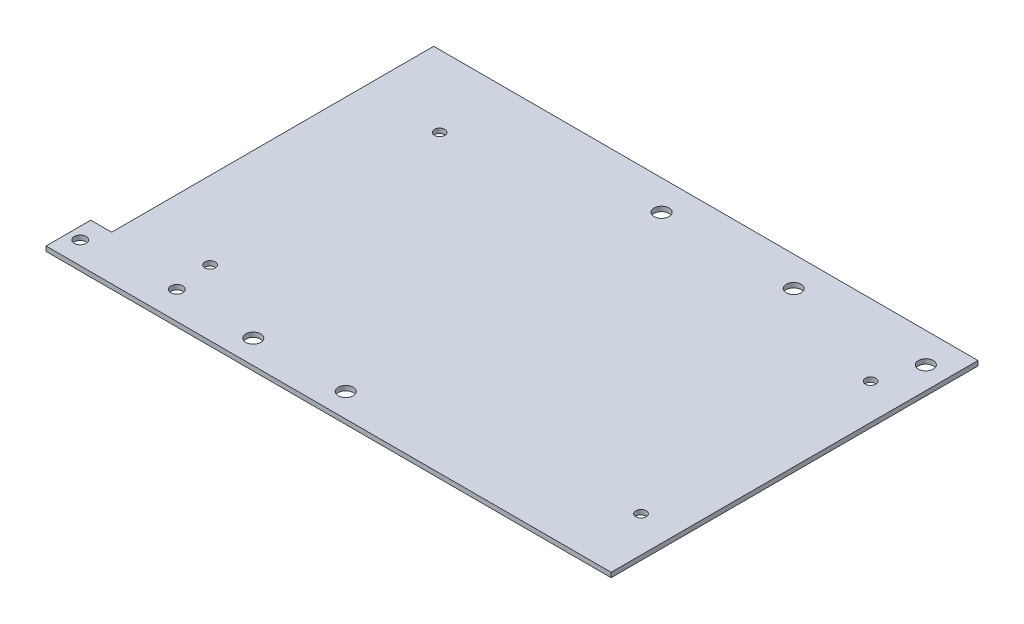
ISO-10303-21;
HEADER;
FILE_DESCRIPTION(('STEP AP214'),'2;1');
FILE_NAME('part.step','',(''),(''),'','','');
FILE_SCHEMA(('AUTOMOTIVE_DESIGN { 1 0 10303 214 1 1 1 1 }'));
ENDSEC;
DATA;
#1=APPLICATION_CONTEXT('core data for automotive mechanical design processes');
#2=APPLICATION_PROTOCOL_DEFINITION('international standard','automotive_design',2000,#1);
#3=PRODUCT_CONTEXT('',#1,'mechanical');
#4=PRODUCT('Part','Part','',(#3));
#5=PRODUCT_RELATED_PRODUCT_CATEGORY('part','',(#4));
#6=PRODUCT_DEFINITION_FORMATION('','',#4);
#7=PRODUCT_DEFINITION_CONTEXT('part definition',#1,'design');
#8=PRODUCT_DEFINITION('design','',#6,#7);
#9=PRODUCT_DEFINITION_SHAPE('','',#8);
#10=(LENGTH_UNIT() NAMED_UNIT(*) SI_UNIT(.MILLI.,.METRE.));
#11=(NAMED_UNIT(*) PLANE_ANGLE_UNIT() SI_UNIT($,.RADIAN.));
#12=(NAMED_UNIT(*) SI_UNIT($,.STERADIAN.) SOLID_ANGLE_UNIT());
#13=UNCERTAINTY_MEASURE_WITH_UNIT(LENGTH_MEASURE(1.E-05),#10,'distance_accuracy_value','');
#14=(GEOMETRIC_REPRESENTATION_CONTEXT(3) GLOBAL_UNCERTAINTY_ASSIGNED_CONTEXT((#13)) GLOBAL_UNIT_ASSIGNED_CONTEXT((#10,
#11,#12)) REPRESENTATION_CONTEXT('',''));
#15=CARTESIAN_POINT('',(0.,0.,0.));
#16=DIRECTION('',(0.,0.,1.));
#17=DIRECTION('',(1.,0.,0.));
#18=AXIS2_PLACEMENT_3D('',#15,#16,#17);
#19=CARTESIAN_POINT('',(366.71344660437,-3.17,2.50000000000005));
#20=DIRECTION('',(-1.,0.,0.));
#21=DIRECTION('',(0.,0.,-1.));
#22=AXIS2_PLACEMENT_3D('',#19,#20,#21);
#23=PLANE('',#22);
#24=DIRECTION('',(0.,-1.,0.));
#25=VECTOR('',#24,1.);
#26=CARTESIAN_POINT('',(366.71344660437,-3.17,2.50000000000005));
#27=LINE('',#26,#25);
#28=CARTESIAN_POINT('',(366.71344660437,0.,2.50000000000005));
#29=VERTEX_POINT('',#28);
#30=CARTESIAN_POINT('',(366.71344660437,-3.17,2.50000000000005));
#31=VERTEX_POINT('',#30);
#32=EDGE_CURVE('E11',#29,#31,#27,.T.);
#33=ORIENTED_EDGE('',*,*,#32,.F.);
#34=DIRECTION('',(0.,0.,-1.));
#35=VECTOR('',#34,1.);
#36=CARTESIAN_POINT('',(366.71344660437,0.,0.));
#37=LINE('',#36,#35);
#38=CARTESIAN_POINT('',(366.71344660437,0.,248.5));
#39=VERTEX_POINT('',#38);
#40=EDGE_CURVE('E104',#39,#29,#37,.T.);
#41=ORIENTED_EDGE('',*,*,#40,.F.);
#42=DIRECTION('',(0.,-1.,0.));
#43=VECTOR('',#42,1.);
#44=CARTESIAN_POINT('',(366.71344660437,-3.17,248.5));
#45=LINE('',#44,#43);
#46=CARTESIAN_POINT('',(366.71344660437,-3.17,248.5));
#47=VERTEX_POINT('',#46);
#48=EDGE_CURVE('E52',#39,#47,#45,.T.);
#49=ORIENTED_EDGE('',*,*,#48,.T.);
#50=DIRECTION('',(0.,0.,-1.));
#51=VECTOR('',#50,1.);
#52=CARTESIAN_POINT('',(366.71344660437,-3.17,2.50000000000005));
#53=LINE('',#52,#51);
#54=EDGE_CURVE('E135',#47,#31,#53,.T.);
#55=ORIENTED_EDGE('',*,*,#54,.T.);
#56=EDGE_LOOP('',(#33,#41,#49,#55));
#57=FACE_BOUND('',#56,.T.);
#58=ADVANCED_FACE('F43',(#57),#23,.F.);
#59=CARTESIAN_POINT('',(-12.28655339563,-3.17,248.5));
#60=DIRECTION('',(0.,0.,-1.));
#61=DIRECTION('',(1.,0.,0.));
#62=AXIS2_PLACEMENT_3D('',#59,#60,#61);
#63=PLANE('',#62);
#64=ORIENTED_EDGE('',*,*,#48,.F.);
#65=DIRECTION('',(1.,0.,0.));
#66=VECTOR('',#65,1.);
#67=CARTESIAN_POINT('',(0.,0.,248.5));
#68=LINE('',#67,#66);
#69=CARTESIAN_POINT('',(-12.28655339563,0.,248.5));
#70=VERTEX_POINT('',#69);
#71=EDGE_CURVE('E119',#70,#39,#68,.T.);
#72=ORIENTED_EDGE('',*,*,#71,.F.);
#73=DIRECTION('',(0.,-1.,0.));
#74=VECTOR('',#73,1.);
#75=CARTESIAN_POINT('',(-12.28655339563,-3.17,248.5));
#76=LINE('',#75,#74);
#77=CARTESIAN_POINT('',(-12.28655339563,-3.17,248.5));
#78=VERTEX_POINT('',#77);
#79=EDGE_CURVE('E129',#70,#78,#76,.T.);
#80=ORIENTED_EDGE('',*,*,#79,.T.);
#81=DIRECTION('',(1.,0.,0.));
#82=VECTOR('',#81,1.);
#83=CARTESIAN_POINT('',(-12.28655339563,-3.17,248.5));
#84=LINE('',#83,#82);
#85=EDGE_CURVE('E145',#78,#47,#84,.T.);
#86=ORIENTED_EDGE('',*,*,#85,.T.);
#87=EDGE_LOOP('',(#64,#72,#80,#86));
#88=FACE_BOUND('',#87,.T.);
#89=ADVANCED_FACE('F143',(#88),#63,.F.);
#90=CARTESIAN_POINT('',(-12.28655339563,-3.17,218.5));
#91=DIRECTION('',(1.,0.,0.));
#92=DIRECTION('',(0.,0.,1.));
#93=AXIS2_PLACEMENT_3D('',#90,#91,#92);
#94=PLANE('',#93);
#95=ORIENTED_EDGE('',*,*,#79,.F.);
#96=DIRECTION('',(0.,0.,-1.));
#97=VECTOR('',#96,1.);
#98=CARTESIAN_POINT('',(-12.28655339563,0.,0.));
#99=LINE('',#98,#97);
#100=CARTESIAN_POINT('',(-12.28655339563,0.,218.5));
#101=VERTEX_POINT('',#100);
#102=EDGE_CURVE('E120',#101,#70,#99,.F.);
#103=ORIENTED_EDGE('',*,*,#102,.F.);
#104=DIRECTION('',(0.,-1.,0.));
#105=VECTOR('',#104,1.);
#106=CARTESIAN_POINT('',(-12.28655339563,-3.17,218.5));
#107=LINE('',#106,#105);
#108=CARTESIAN_POINT('',(-12.28655339563,-3.17,218.5));
#109=VERTEX_POINT('',#108);
#110=EDGE_CURVE('E121',#101,#109,#107,.T.);
#111=ORIENTED_EDGE('',*,*,#110,.T.);
#112=DIRECTION('',(0.,0.,1.));
#113=VECTOR('',#112,1.);
#114=CARTESIAN_POINT('',(-12.28655339563,-3.17,218.5));
#115=LINE('',#114,#113);
#116=EDGE_CURVE('E149',#109,#78,#115,.T.);
#117=ORIENTED_EDGE('',*,*,#116,.T.);
#118=EDGE_LOOP('',(#95,#103,#111,#117));
#119=FACE_BOUND('',#118,.T.);
#120=ADVANCED_FACE('F210',(#119),#94,.F.);
#121=CARTESIAN_POINT('',(1.71344660436998,-3.17,218.5));
#122=DIRECTION('',(0.,0.,1.));
#123=DIRECTION('',(-1.,0.,0.));
#124=AXIS2_PLACEMENT_3D('',#121,#122,#123);
#125=PLANE('',#124);
#126=ORIENTED_EDGE('',*,*,#110,.F.);
#127=DIRECTION('',(1.,0.,0.));
#128=VECTOR('',#127,1.);
#129=CARTESIAN_POINT('',(0.,0.,218.5));
#130=LINE('',#129,#128);
#131=CARTESIAN_POINT('',(1.71344660436998,0.,218.5));
#132=VERTEX_POINT('',#131);
#133=EDGE_CURVE('E112',#132,#101,#130,.F.);
#134=ORIENTED_EDGE('',*,*,#133,.F.);
#135=DIRECTION('',(0.,-1.,0.));
#136=VECTOR('',#135,1.);
#137=CARTESIAN_POINT('',(1.71344660436998,-3.17,218.5));
#138=LINE('',#137,#136);
#139=CARTESIAN_POINT('',(1.71344660436998,-3.17,218.5));
#140=VERTEX_POINT('',#139);
#141=EDGE_CURVE('E64',#132,#140,#138,.T.);
#142=ORIENTED_EDGE('',*,*,#141,.T.);
#143=DIRECTION('',(-1.,0.,0.));
#144=VECTOR('',#143,1.);
#145=CARTESIAN_POINT('',(1.71344660436998,-3.17,218.5));
#146=LINE('',#145,#144);
#147=EDGE_CURVE('E97',#140,#109,#146,.T.);
#148=ORIENTED_EDGE('',*,*,#147,.T.);
#149=EDGE_LOOP('',(#126,#134,#142,#148));
#150=FACE_BOUND('',#149,.T.);
#151=ADVANCED_FACE('F211',(#150),#125,.F.);
#152=CARTESIAN_POINT('',(1.71344660436995,-3.17,2.50000000000004));
#153=DIRECTION('',(1.,0.,0.));
#154=DIRECTION('',(0.,0.,1.));
#155=AXIS2_PLACEMENT_3D('',#152,#153,#154);
#156=PLANE('',#155);
#157=ORIENTED_EDGE('',*,*,#141,.F.);
#158=DIRECTION('',(0.,0.,-1.));
#159=VECTOR('',#158,1.);
#160=CARTESIAN_POINT('',(1.71344660436995,0.,0.));
#161=LINE('',#160,#159);
#162=CARTESIAN_POINT('',(1.71344660436995,0.,2.50000000000004));
#163=VERTEX_POINT('',#162);
#164=EDGE_CURVE('E105',#163,#132,#161,.F.);
#165=ORIENTED_EDGE('',*,*,#164,.F.);
#166=DIRECTION('',(0.,-1.,0.));
#167=VECTOR('',#166,1.);
#168=CARTESIAN_POINT('',(1.71344660436995,-3.17,2.50000000000004));
#169=LINE('',#168,#167);
#170=CARTESIAN_POINT('',(1.71344660436995,-3.17,2.50000000000004));
#171=VERTEX_POINT('',#170);
#172=EDGE_CURVE('E50',#163,#171,#169,.T.);
#173=ORIENTED_EDGE('',*,*,#172,.T.);
#174=DIRECTION('',(0.,0.,1.));
#175=VECTOR('',#174,1.);
#176=CARTESIAN_POINT('',(1.71344660436995,-3.17,2.50000000000004));
#177=LINE('',#176,#175);
#178=EDGE_CURVE('E277',#171,#140,#177,.T.);
#179=ORIENTED_EDGE('',*,*,#178,.T.);
#180=EDGE_LOOP('',(#157,#165,#173,#179));
#181=FACE_BOUND('',#180,.T.);
#182=ADVANCED_FACE('F106',(#181),#156,.F.);
#183=CARTESIAN_POINT('',(174.553221886282,-3.17,22.5000000000001));
#184=DIRECTION('',(0.,-1.,0.));
#185=DIRECTION('',(0.,0.,-1.));
#186=AXIS2_PLACEMENT_3D('',#183,#184,#185);
#187=CYLINDRICAL_SURFACE('',#186,5.00000000000002);
#188=CARTESIAN_POINT('',(174.553221886282,-3.17,22.5000000000001));
#189=DIRECTION('',(0.,1.,0.));
#190=DIRECTION('',(0.,0.,1.));
#191=AXIS2_PLACEMENT_3D('',#188,#189,#190);
#192=CIRCLE('',#191,5.00000000000002);
#193=CARTESIAN_POINT('',(174.553221886282,-3.17,27.5000000000001));
#194=VERTEX_POINT('',#193);
#195=EDGE_CURVE('E116',#194,#194,#192,.T.);
#196=ORIENTED_EDGE('',*,*,#195,.F.);
#197=EDGE_LOOP('',(#196));
#198=FACE_BOUND('',#197,.T.);
#199=CARTESIAN_POINT('',(174.553221886282,0.,22.5000000000001));
#200=DIRECTION('',(0.,1.,0.));
#201=DIRECTION('',(0.,0.,1.));
#202=AXIS2_PLACEMENT_3D('',#199,#200,#201);
#203=CIRCLE('',#202,5.00000000000002);
#204=CARTESIAN_POINT('',(174.553221886282,0.,27.5000000000001));
#205=VERTEX_POINT('',#204);
#206=EDGE_CURVE('E154',#205,#205,#203,.T.);
#207=ORIENTED_EDGE('',*,*,#206,.T.);
#208=EDGE_LOOP('',(#207));
#209=FACE_BOUND('',#208,.T.);
#210=ADVANCED_FACE('F217',(#198,#209),#187,.F.);
#211=CARTESIAN_POINT('',(263.133334245326,-3.17,22.5));
#212=DIRECTION('',(0.,-1.,0.));
#213=DIRECTION('',(0.,0.,-1.));
#214=AXIS2_PLACEMENT_3D('',#211,#212,#213);
#215=CYLINDRICAL_SURFACE('',#214,4.99999999999999);
#216=CARTESIAN_POINT('',(263.133334245326,-3.17,22.5));
#217=DIRECTION('',(0.,1.,0.));
#218=DIRECTION('',(0.,0.,1.));
#219=AXIS2_PLACEMENT_3D('',#216,#217,#218);
#220=CIRCLE('',#219,4.99999999999999);
#221=CARTESIAN_POINT('',(263.133334245326,-3.17,27.5));
#222=VERTEX_POINT('',#221);
#223=EDGE_CURVE('E296',#222,#222,#220,.T.);
#224=ORIENTED_EDGE('',*,*,#223,.F.);
#225=EDGE_LOOP('',(#224));
#226=FACE_BOUND('',#225,.T.);
#227=CARTESIAN_POINT('',(263.133334245326,0.,22.5));
#228=DIRECTION('',(0.,1.,0.));
#229=DIRECTION('',(0.,0.,1.));
#230=AXIS2_PLACEMENT_3D('',#227,#228,#229);
#231=CIRCLE('',#230,4.99999999999999);
#232=CARTESIAN_POINT('',(263.133334245326,0.,27.5));
#233=VERTEX_POINT('',#232);
#234=EDGE_CURVE('E153',#233,#233,#231,.T.);
#235=ORIENTED_EDGE('',*,*,#234,.T.);
#236=EDGE_LOOP('',(#235));
#237=FACE_BOUND('',#236,.T.);
#238=ADVANCED_FACE('F218',(#226,#237),#215,.F.);
#239=CARTESIAN_POINT('',(342.71344660437,-3.17,50.4999999999996));
#240=DIRECTION('',(0.,-1.,0.));
#241=DIRECTION('',(0.,0.,-1.));
#242=AXIS2_PLACEMENT_3D('',#239,#240,#241);
#243=CYLINDRICAL_SURFACE('',#242,3.50000000000002);
#244=CARTESIAN_POINT('',(342.71344660437,-3.17,50.4999999999996));
#245=DIRECTION('',(0.,1.,0.));
#246=DIRECTION('',(0.,0.,1.));
#247=AXIS2_PLACEMENT_3D('',#244,#245,#246);
#248=CIRCLE('',#247,3.50000000000002);
#249=CARTESIAN_POINT('',(342.71344660437,-3.17,53.9999999999997));
#250=VERTEX_POINT('',#249);
#251=EDGE_CURVE('E305',#250,#250,#248,.T.);
#252=ORIENTED_EDGE('',*,*,#251,.F.);
#253=EDGE_LOOP('',(#252));
#254=FACE_BOUND('',#253,.T.);
#255=CARTESIAN_POINT('',(342.71344660437,0.,50.4999999999996));
#256=DIRECTION('',(0.,1.,0.));
#257=DIRECTION('',(0.,0.,1.));
#258=AXIS2_PLACEMENT_3D('',#255,#256,#257);
#259=CIRCLE('',#258,3.50000000000002);
#260=CARTESIAN_POINT('',(342.71344660437,0.,53.9999999999997));
#261=VERTEX_POINT('',#260);
#262=EDGE_CURVE('E160',#261,#261,#259,.T.);
#263=ORIENTED_EDGE('',*,*,#262,.T.);
#264=EDGE_LOOP('',(#263));
#265=FACE_BOUND('',#264,.T.);
#266=ADVANCED_FACE('F228',(#254,#265),#243,.F.);
#267=CARTESIAN_POINT('',(53.71344660437,-3.17,50.4999999999997));
#268=DIRECTION('',(0.,-1.,0.));
#269=DIRECTION('',(0.,0.,-1.));
#270=AXIS2_PLACEMENT_3D('',#267,#268,#269);
#271=CYLINDRICAL_SURFACE('',#270,3.5);
#272=CARTESIAN_POINT('',(53.71344660437,-3.17,50.4999999999997));
#273=DIRECTION('',(0.,1.,0.));
#274=DIRECTION('',(0.,0.,1.));
#275=AXIS2_PLACEMENT_3D('',#272,#273,#274);
#276=CIRCLE('',#275,3.5);
#277=CARTESIAN_POINT('',(53.71344660437,-3.17,53.9999999999997));
#278=VERTEX_POINT('',#277);
#279=EDGE_CURVE('E306',#278,#278,#276,.T.);
#280=ORIENTED_EDGE('',*,*,#279,.F.);
#281=EDGE_LOOP('',(#280));
#282=FACE_BOUND('',#281,.T.);
#283=CARTESIAN_POINT('',(53.71344660437,0.,50.4999999999997));
#284=DIRECTION('',(0.,1.,0.));
#285=DIRECTION('',(0.,0.,1.));
#286=AXIS2_PLACEMENT_3D('',#283,#284,#285);
#287=CIRCLE('',#286,3.5);
#288=CARTESIAN_POINT('',(53.71344660437,0.,53.9999999999997));
#289=VERTEX_POINT('',#288);
#290=EDGE_CURVE('E163',#289,#289,#287,.T.);
#291=ORIENTED_EDGE('',*,*,#290,.T.);
#292=EDGE_LOOP('',(#291));
#293=FACE_BOUND('',#292,.T.);
#294=ADVANCED_FACE('F232',(#282,#293),#271,.F.);
#295=CARTESIAN_POINT('',(342.71344660437,-3.17,204.5));
#296=DIRECTION('',(0.,-1.,0.));
#297=DIRECTION('',(0.,0.,-1.));
#298=AXIS2_PLACEMENT_3D('',#295,#296,#297);
#299=CYLINDRICAL_SURFACE('',#298,3.50000000000002);
#300=CARTESIAN_POINT('',(342.71344660437,-3.17,204.5));
#301=DIRECTION('',(0.,1.,0.));
#302=DIRECTION('',(0.,0.,1.));
#303=AXIS2_PLACEMENT_3D('',#300,#301,#302);
#304=CIRCLE('',#303,3.50000000000002);
#305=CARTESIAN_POINT('',(342.71344660437,-3.17,208.));
#306=VERTEX_POINT('',#305);
#307=EDGE_CURVE('E309',#306,#306,#304,.T.);
#308=ORIENTED_EDGE('',*,*,#307,.F.);
#309=EDGE_LOOP('',(#308));
#310=FACE_BOUND('',#309,.T.);
#311=CARTESIAN_POINT('',(342.71344660437,0.,204.5));
#312=DIRECTION('',(0.,1.,0.));
#313=DIRECTION('',(0.,0.,1.));
#314=AXIS2_PLACEMENT_3D('',#311,#312,#313);
#315=CIRCLE('',#314,3.50000000000002);
#316=CARTESIAN_POINT('',(342.71344660437,0.,208.));
#317=VERTEX_POINT('',#316);
#318=EDGE_CURVE('E165',#317,#317,#315,.T.);
#319=ORIENTED_EDGE('',*,*,#318,.T.);
#320=EDGE_LOOP('',(#319));
#321=FACE_BOUND('',#320,.T.);
#322=ADVANCED_FACE('F237',(#310,#321),#299,.F.);
#323=CARTESIAN_POINT('',(53.71344660437,-3.17,204.5));
#324=DIRECTION('',(0.,-1.,0.));
#325=DIRECTION('',(0.,0.,-1.));
#326=AXIS2_PLACEMENT_3D('',#323,#324,#325);
#327=CYLINDRICAL_SURFACE('',#326,3.5);
#328=CARTESIAN_POINT('',(53.71344660437,-3.17,204.5));
#329=DIRECTION('',(0.,1.,0.));
#330=DIRECTION('',(0.,0.,1.));
#331=AXIS2_PLACEMENT_3D('',#328,#329,#330);
#332=CIRCLE('',#331,3.5);
#333=CARTESIAN_POINT('',(53.71344660437,-3.17,208.));
#334=VERTEX_POINT('',#333);
#335=EDGE_CURVE('E313',#334,#334,#332,.T.);
#336=ORIENTED_EDGE('',*,*,#335,.F.);
#337=EDGE_LOOP('',(#336));
#338=FACE_BOUND('',#337,.T.);
#339=CARTESIAN_POINT('',(53.71344660437,0.,204.5));
#340=DIRECTION('',(0.,1.,0.));
#341=DIRECTION('',(0.,0.,1.));
#342=AXIS2_PLACEMENT_3D('',#339,#340,#341);
#343=CIRCLE('',#342,3.5);
#344=CARTESIAN_POINT('',(53.71344660437,0.,208.));
#345=VERTEX_POINT('',#344);
#346=EDGE_CURVE('E170',#345,#345,#343,.T.);
#347=ORIENTED_EDGE('',*,*,#346,.T.);
#348=EDGE_LOOP('',(#347));
#349=FACE_BOUND('',#348,.T.);
#350=ADVANCED_FACE('F243',(#338,#349),#327,.F.);
#351=CARTESIAN_POINT('',(110.71344660437,-3.17,232.5));
#352=DIRECTION('',(0.,-1.,0.));
#353=DIRECTION('',(0.,0.,-1.));
#354=AXIS2_PLACEMENT_3D('',#351,#352,#353);
#355=CYLINDRICAL_SURFACE('',#354,5.00000000000001);
#356=CARTESIAN_POINT('',(110.71344660437,-3.17,232.5));
#357=DIRECTION('',(0.,1.,0.));
#358=DIRECTION('',(0.,0.,1.));
#359=AXIS2_PLACEMENT_3D('',#356,#357,#358);
#360=CIRCLE('',#359,5.00000000000001);
#361=CARTESIAN_POINT('',(110.71344660437,-3.17,237.5));
#362=VERTEX_POINT('',#361);
#363=EDGE_CURVE('E274',#362,#362,#360,.T.);
#364=ORIENTED_EDGE('',*,*,#363,.F.);
#365=EDGE_LOOP('',(#364));
#366=FACE_BOUND('',#365,.T.);
#367=CARTESIAN_POINT('',(110.71344660437,0.,232.5));
#368=DIRECTION('',(0.,1.,0.));
#369=DIRECTION('',(0.,0.,1.));
#370=AXIS2_PLACEMENT_3D('',#367,#368,#369);
#371=CIRCLE('',#370,5.00000000000001);
#372=CARTESIAN_POINT('',(110.71344660437,0.,237.5));
#373=VERTEX_POINT('',#372);
#374=EDGE_CURVE('E167',#373,#373,#371,.T.);
#375=ORIENTED_EDGE('',*,*,#374,.T.);
#376=EDGE_LOOP('',(#375));
#377=FACE_BOUND('',#376,.T.);
#378=ADVANCED_FACE('F250',(#366,#377),#355,.F.);
#379=CARTESIAN_POINT('',(172.71344660437,-3.17,232.5));
#380=DIRECTION('',(0.,-1.,0.));
#381=DIRECTION('',(0.,0.,-1.));
#382=AXIS2_PLACEMENT_3D('',#379,#380,#381);
#383=CYLINDRICAL_SURFACE('',#382,5.00000000000002);
#384=CARTESIAN_POINT('',(172.71344660437,-3.17,232.5));
#385=DIRECTION('',(0.,1.,0.));
#386=DIRECTION('',(0.,0.,1.));
#387=AXIS2_PLACEMENT_3D('',#384,#385,#386);
#388=CIRCLE('',#387,5.00000000000002);
#389=CARTESIAN_POINT('',(172.71344660437,-3.17,237.5));
#390=VERTEX_POINT('',#389);
#391=EDGE_CURVE('E268',#390,#390,#388,.T.);
#392=ORIENTED_EDGE('',*,*,#391,.F.);
#393=EDGE_LOOP('',(#392));
#394=FACE_BOUND('',#393,.T.);
#395=CARTESIAN_POINT('',(172.71344660437,0.,232.5));
#396=DIRECTION('',(0.,1.,0.));
#397=DIRECTION('',(0.,0.,1.));
#398=AXIS2_PLACEMENT_3D('',#395,#396,#397);
#399=CIRCLE('',#398,5.00000000000002);
#400=CARTESIAN_POINT('',(172.71344660437,0.,237.5));
#401=VERTEX_POINT('',#400);
#402=EDGE_CURVE('E173',#401,#401,#399,.T.);
#403=ORIENTED_EDGE('',*,*,#402,.T.);
#404=EDGE_LOOP('',(#403));
#405=FACE_BOUND('',#404,.T.);
#406=ADVANCED_FACE('F252',(#394,#405),#383,.F.);
#407=CARTESIAN_POINT('',(351.71344660437,-3.17,22.5000000000001));
#408=DIRECTION('',(0.,-1.,0.));
#409=DIRECTION('',(0.,0.,-1.));
#410=AXIS2_PLACEMENT_3D('',#407,#408,#409);
#411=CYLINDRICAL_SURFACE('',#410,4.99999999999999);
#412=CARTESIAN_POINT('',(351.71344660437,-3.17,22.5000000000001));
#413=DIRECTION('',(0.,1.,0.));
#414=DIRECTION('',(0.,0.,1.));
#415=AXIS2_PLACEMENT_3D('',#412,#413,#414);
#416=CIRCLE('',#415,4.99999999999999);
#417=CARTESIAN_POINT('',(351.71344660437,-3.17,27.5000000000001));
#418=VERTEX_POINT('',#417);
#419=EDGE_CURVE('E265',#418,#418,#416,.T.);
#420=ORIENTED_EDGE('',*,*,#419,.F.);
#421=EDGE_LOOP('',(#420));
#422=FACE_BOUND('',#421,.T.);
#423=CARTESIAN_POINT('',(351.71344660437,0.,22.5000000000001));
#424=DIRECTION('',(0.,1.,0.));
#425=DIRECTION('',(0.,0.,1.));
#426=AXIS2_PLACEMENT_3D('',#423,#424,#425);
#427=CIRCLE('',#426,4.99999999999999);
#428=CARTESIAN_POINT('',(351.71344660437,0.,27.5000000000001));
#429=VERTEX_POINT('',#428);
#430=EDGE_CURVE('E176',#429,#429,#427,.T.);
#431=ORIENTED_EDGE('',*,*,#430,.T.);
#432=EDGE_LOOP('',(#431));
#433=FACE_BOUND('',#432,.T.);
#434=ADVANCED_FACE('F199',(#422,#433),#411,.F.);
#435=CARTESIAN_POINT('',(56.7540691016957,-3.17,229.789646052743));
#436=DIRECTION('',(0.,-1.,0.));
#437=DIRECTION('',(0.,0.,-1.));
#438=AXIS2_PLACEMENT_3D('',#435,#436,#437);
#439=CYLINDRICAL_SURFACE('',#438,4.00000000000001);
#440=CARTESIAN_POINT('',(56.7540691016957,-3.17,229.789646052743));
#441=DIRECTION('',(0.,1.,0.));
#442=DIRECTION('',(0.,0.,1.));
#443=AXIS2_PLACEMENT_3D('',#440,#441,#442);
#444=CIRCLE('',#443,4.00000000000001);
#445=CARTESIAN_POINT('',(56.7540691016957,-3.17,233.789646052743));
#446=VERTEX_POINT('',#445);
#447=EDGE_CURVE('E270',#446,#446,#444,.T.);
#448=ORIENTED_EDGE('',*,*,#447,.F.);
#449=EDGE_LOOP('',(#448));
#450=FACE_BOUND('',#449,.T.);
#451=CARTESIAN_POINT('',(56.7540691016957,0.,229.789646052743));
#452=DIRECTION('',(0.,1.,0.));
#453=DIRECTION('',(0.,0.,1.));
#454=AXIS2_PLACEMENT_3D('',#451,#452,#453);
#455=CIRCLE('',#454,4.00000000000001);
#456=CARTESIAN_POINT('',(56.7540691016957,0.,233.789646052743));
#457=VERTEX_POINT('',#456);
#458=EDGE_CURVE('E109',#457,#457,#455,.T.);
#459=ORIENTED_EDGE('',*,*,#458,.T.);
#460=EDGE_LOOP('',(#459));
#461=FACE_BOUND('',#460,.T.);
#462=ADVANCED_FACE('F181',(#450,#461),#439,.F.);
#463=CARTESIAN_POINT('',(-4.33335410133425,-3.17,233.5));
#464=DIRECTION('',(0.,-1.,0.));
#465=DIRECTION('',(0.,0.,-1.));
#466=AXIS2_PLACEMENT_3D('',#463,#464,#465);
#467=CYLINDRICAL_SURFACE('',#466,4.00000000000001);
#468=CARTESIAN_POINT('',(-4.33335410133425,-3.17,233.5));
#469=DIRECTION('',(0.,1.,0.));
#470=DIRECTION('',(0.,0.,1.));
#471=AXIS2_PLACEMENT_3D('',#468,#469,#470);
#472=CIRCLE('',#471,4.00000000000001);
#473=CARTESIAN_POINT('',(-4.33335410133425,-3.17,237.5));
#474=VERTEX_POINT('',#473);
#475=EDGE_CURVE('E272',#474,#474,#472,.T.);
#476=ORIENTED_EDGE('',*,*,#475,.F.);
#477=EDGE_LOOP('',(#476));
#478=FACE_BOUND('',#477,.T.);
#479=CARTESIAN_POINT('',(-4.33335410133425,0.,233.5));
#480=DIRECTION('',(0.,1.,0.));
#481=DIRECTION('',(0.,0.,1.));
#482=AXIS2_PLACEMENT_3D('',#479,#480,#481);
#483=CIRCLE('',#482,4.00000000000001);
#484=CARTESIAN_POINT('',(-4.33335410133425,0.,237.5));
#485=VERTEX_POINT('',#484);
#486=EDGE_CURVE('E110',#485,#485,#483,.T.);
#487=ORIENTED_EDGE('',*,*,#486,.T.);
#488=EDGE_LOOP('',(#487));
#489=FACE_BOUND('',#488,.T.);
#490=ADVANCED_FACE('F186',(#478,#489),#467,.F.);
#491=CARTESIAN_POINT('',(1.71344660436995,-3.17,2.50000000000004));
#492=DIRECTION('',(0.,0.,1.));
#493=DIRECTION('',(-1.,0.,0.));
#494=AXIS2_PLACEMENT_3D('',#491,#492,#493);
#495=PLANE('',#494);
#496=DIRECTION('',(1.,0.,0.));
#497=VECTOR('',#496,1.);
#498=CARTESIAN_POINT('',(0.,0.,2.50000000000005));
#499=LINE('',#498,#497);
#500=EDGE_CURVE('E92',#29,#163,#499,.F.);
#501=ORIENTED_EDGE('',*,*,#500,.F.);
#502=ORIENTED_EDGE('',*,*,#32,.T.);
#503=DIRECTION('',(-1.,0.,0.));
#504=VECTOR('',#503,1.);
#505=CARTESIAN_POINT('',(1.71344660436995,-3.17,2.50000000000004));
#506=LINE('',#505,#504);
#507=EDGE_CURVE('E95',#31,#171,#506,.T.);
#508=ORIENTED_EDGE('',*,*,#507,.T.);
#509=ORIENTED_EDGE('',*,*,#172,.F.);
#510=EDGE_LOOP('',(#501,#502,#508,#509));
#511=FACE_BOUND('',#510,.T.);
#512=ADVANCED_FACE('F44',(#511),#495,.F.);
#513=CARTESIAN_POINT('',(0.,-3.17,0.));
#514=DIRECTION('',(0.,-1.,0.));
#515=DIRECTION('',(0.,0.,-1.));
#516=AXIS2_PLACEMENT_3D('',#513,#514,#515);
#517=PLANE('',#516);
#518=ORIENTED_EDGE('',*,*,#195,.T.);
#519=EDGE_LOOP('',(#518));
#520=FACE_BOUND('',#519,.T.);
#521=ORIENTED_EDGE('',*,*,#223,.T.);
#522=EDGE_LOOP('',(#521));
#523=FACE_BOUND('',#522,.T.);
#524=ORIENTED_EDGE('',*,*,#251,.T.);
#525=EDGE_LOOP('',(#524));
#526=FACE_BOUND('',#525,.T.);
#527=ORIENTED_EDGE('',*,*,#279,.T.);
#528=EDGE_LOOP('',(#527));
#529=FACE_BOUND('',#528,.T.);
#530=ORIENTED_EDGE('',*,*,#307,.T.);
#531=EDGE_LOOP('',(#530));
#532=FACE_BOUND('',#531,.T.);
#533=ORIENTED_EDGE('',*,*,#335,.T.);
#534=EDGE_LOOP('',(#533));
#535=FACE_BOUND('',#534,.T.);
#536=ORIENTED_EDGE('',*,*,#363,.T.);
#537=EDGE_LOOP('',(#536));
#538=FACE_BOUND('',#537,.T.);
#539=ORIENTED_EDGE('',*,*,#391,.T.);
#540=EDGE_LOOP('',(#539));
#541=FACE_BOUND('',#540,.T.);
#542=ORIENTED_EDGE('',*,*,#419,.T.);
#543=EDGE_LOOP('',(#542));
#544=FACE_BOUND('',#543,.T.);
#545=ORIENTED_EDGE('',*,*,#447,.T.);
#546=EDGE_LOOP('',(#545));
#547=FACE_BOUND('',#546,.T.);
#548=ORIENTED_EDGE('',*,*,#475,.T.);
#549=EDGE_LOOP('',(#548));
#550=FACE_BOUND('',#549,.T.);
#551=ORIENTED_EDGE('',*,*,#178,.F.);
#552=ORIENTED_EDGE('',*,*,#507,.F.);
#553=ORIENTED_EDGE('',*,*,#54,.F.);
#554=ORIENTED_EDGE('',*,*,#85,.F.);
#555=ORIENTED_EDGE('',*,*,#116,.F.);
#556=ORIENTED_EDGE('',*,*,#147,.F.);
#557=EDGE_LOOP('',(#551,#552,#553,#554,#555,#556));
#558=FACE_BOUND('',#557,.T.);
#559=ADVANCED_FACE('F136',(#520,#523,#526,#529,#532,#535,#538,#541,#544,#547,#550,#558),#517,.T.);
#560=CARTESIAN_POINT('',(0.,0.,0.));
#561=DIRECTION('',(0.,-1.,0.));
#562=DIRECTION('',(0.,0.,-1.));
#563=AXIS2_PLACEMENT_3D('',#560,#561,#562);
#564=PLANE('',#563);
#565=ORIENTED_EDGE('',*,*,#206,.F.);
#566=EDGE_LOOP('',(#565));
#567=FACE_BOUND('',#566,.T.);
#568=ORIENTED_EDGE('',*,*,#234,.F.);
#569=EDGE_LOOP('',(#568));
#570=FACE_BOUND('',#569,.T.);
#571=ORIENTED_EDGE('',*,*,#262,.F.);
#572=EDGE_LOOP('',(#571));
#573=FACE_BOUND('',#572,.T.);
#574=ORIENTED_EDGE('',*,*,#290,.F.);
#575=EDGE_LOOP('',(#574));
#576=FACE_BOUND('',#575,.T.);
#577=ORIENTED_EDGE('',*,*,#318,.F.);
#578=EDGE_LOOP('',(#577));
#579=FACE_BOUND('',#578,.T.);
#580=ORIENTED_EDGE('',*,*,#346,.F.);
#581=EDGE_LOOP('',(#580));
#582=FACE_BOUND('',#581,.T.);
#583=ORIENTED_EDGE('',*,*,#374,.F.);
#584=EDGE_LOOP('',(#583));
#585=FACE_BOUND('',#584,.T.);
#586=ORIENTED_EDGE('',*,*,#402,.F.);
#587=EDGE_LOOP('',(#586));
#588=FACE_BOUND('',#587,.T.);
#589=ORIENTED_EDGE('',*,*,#430,.F.);
#590=EDGE_LOOP('',(#589));
#591=FACE_BOUND('',#590,.T.);
#592=ORIENTED_EDGE('',*,*,#458,.F.);
#593=EDGE_LOOP('',(#592));
#594=FACE_BOUND('',#593,.T.);
#595=ORIENTED_EDGE('',*,*,#486,.F.);
#596=EDGE_LOOP('',(#595));
#597=FACE_BOUND('',#596,.T.);
#598=ORIENTED_EDGE('',*,*,#164,.T.);
#599=ORIENTED_EDGE('',*,*,#133,.T.);
#600=ORIENTED_EDGE('',*,*,#102,.T.);
#601=ORIENTED_EDGE('',*,*,#71,.T.);
#602=ORIENTED_EDGE('',*,*,#40,.T.);
#603=ORIENTED_EDGE('',*,*,#500,.T.);
#604=EDGE_LOOP('',(#598,#599,#600,#601,#602,#603));
#605=FACE_BOUND('',#604,.T.);
#606=ADVANCED_FACE('F99',(#567,#570,#573,#576,#579,#582,#585,#588,#591,#594,#597,#605),#564,.F.);
#607=CLOSED_SHELL('',(#58,#89,#120,#151,#182,#210,#238,#266,#294,#322,#350,#378,#406,#434,#462,
#490,#512,#559,#606));
#608=MANIFOLD_SOLID_BREP('B2',#607);
#609=ADVANCED_BREP_SHAPE_REPRESENTATION('',(#18,#608),#14);
#610=SHAPE_DEFINITION_REPRESENTATION(#9,#609);
ENDSEC;
END-ISO-10303-21;
